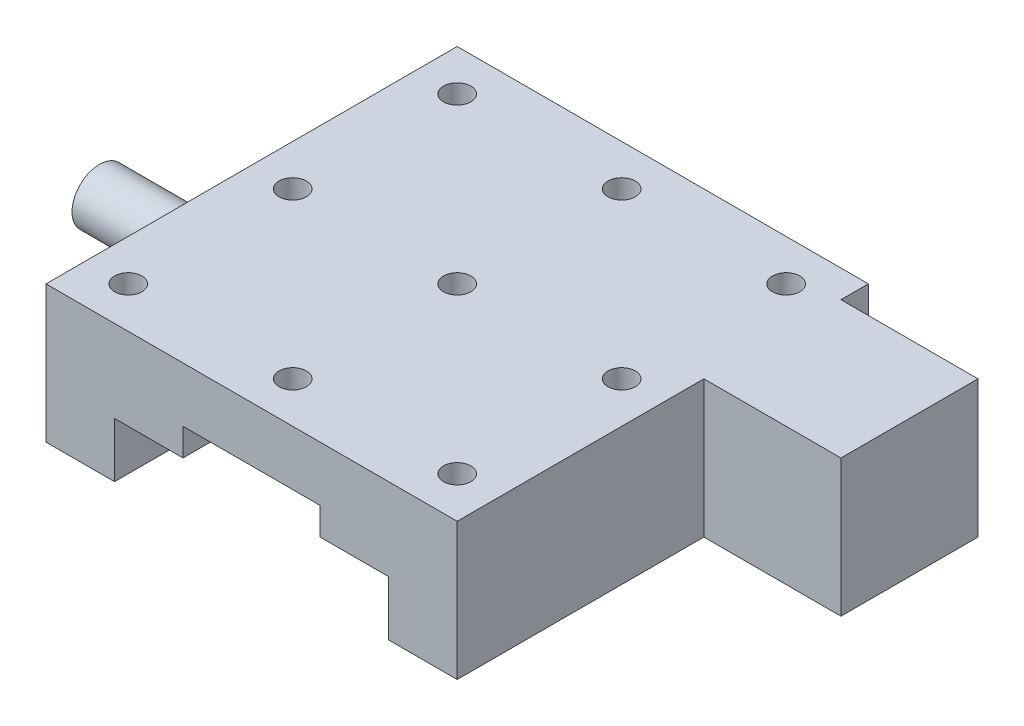
ISO-10303-21;
HEADER;
FILE_DESCRIPTION(('STEP AP214'),'2;1');
FILE_NAME('part.step','',(''),(''),'','','');
FILE_SCHEMA(('AUTOMOTIVE_DESIGN { 1 0 10303 214 1 1 1 1 }'));
ENDSEC;
DATA;
#1=APPLICATION_CONTEXT('core data for automotive mechanical design processes');
#2=APPLICATION_PROTOCOL_DEFINITION('international standard','automotive_design',2000,#1);
#3=PRODUCT_CONTEXT('',#1,'mechanical');
#4=PRODUCT('Part','Part','',(#3));
#5=PRODUCT_RELATED_PRODUCT_CATEGORY('part','',(#4));
#6=PRODUCT_DEFINITION_FORMATION('','',#4);
#7=PRODUCT_DEFINITION_CONTEXT('part definition',#1,'design');
#8=PRODUCT_DEFINITION('design','',#6,#7);
#9=PRODUCT_DEFINITION_SHAPE('','',#8);
#10=(LENGTH_UNIT() NAMED_UNIT(*) SI_UNIT(.MILLI.,.METRE.));
#11=(NAMED_UNIT(*) PLANE_ANGLE_UNIT() SI_UNIT($,.RADIAN.));
#12=(NAMED_UNIT(*) SI_UNIT($,.STERADIAN.) SOLID_ANGLE_UNIT());
#13=UNCERTAINTY_MEASURE_WITH_UNIT(LENGTH_MEASURE(1.E-05),#10,'distance_accuracy_value','');
#14=(GEOMETRIC_REPRESENTATION_CONTEXT(3) GLOBAL_UNCERTAINTY_ASSIGNED_CONTEXT((#13)) GLOBAL_UNIT_ASSIGNED_CONTEXT((#10,
#11,#12)) REPRESENTATION_CONTEXT('',''));
#15=CARTESIAN_POINT('',(0.,0.,0.));
#16=DIRECTION('',(0.,0.,1.));
#17=DIRECTION('',(1.,0.,0.));
#18=AXIS2_PLACEMENT_3D('',#15,#16,#17);
#19=CARTESIAN_POINT('',(30.,10.,0.));
#20=DIRECTION('',(-1.,0.,0.));
#21=DIRECTION('',(0.,0.,1.));
#22=AXIS2_PLACEMENT_3D('',#19,#20,#21);
#23=PLANE('',#22);
#24=DIRECTION('',(0.,1.,0.));
#25=VECTOR('',#24,1.);
#26=CARTESIAN_POINT('',(30.,10.,-28.));
#27=LINE('',#26,#25);
#28=CARTESIAN_POINT('',(30.,0.,-28.));
#29=VERTEX_POINT('',#28);
#30=CARTESIAN_POINT('',(30.,10.,-28.));
#31=VERTEX_POINT('',#30);
#32=EDGE_CURVE('E169',#29,#31,#27,.T.);
#33=ORIENTED_EDGE('',*,*,#32,.F.);
#34=DIRECTION('',(0.,0.,-1.));
#35=VECTOR('',#34,1.);
#36=CARTESIAN_POINT('',(30.,0.,0.));
#37=LINE('',#36,#35);
#38=CARTESIAN_POINT('',(30.,0.,-30.));
#39=VERTEX_POINT('',#38);
#40=EDGE_CURVE('E318',#29,#39,#37,.T.);
#41=ORIENTED_EDGE('',*,*,#40,.T.);
#42=DIRECTION('',(0.,-1.,0.));
#43=VECTOR('',#42,1.);
#44=CARTESIAN_POINT('',(30.,10.,-30.));
#45=LINE('',#44,#43);
#46=CARTESIAN_POINT('',(30.,10.,-30.));
#47=VERTEX_POINT('',#46);
#48=EDGE_CURVE('E334',#47,#39,#45,.T.);
#49=ORIENTED_EDGE('',*,*,#48,.F.);
#50=DIRECTION('',(0.,0.,-1.));
#51=VECTOR('',#50,1.);
#52=CARTESIAN_POINT('',(30.,10.,0.));
#53=LINE('',#52,#51);
#54=EDGE_CURVE('E51',#31,#47,#53,.T.);
#55=ORIENTED_EDGE('',*,*,#54,.F.);
#56=EDGE_LOOP('',(#33,#41,#49,#55));
#57=FACE_BOUND('',#56,.T.);
#58=ADVANCED_FACE('F36',(#57),#23,.F.);
#59=DIRECTION('',(0.,-1.,0.));
#60=VECTOR('',#59,1.);
#61=CARTESIAN_POINT('',(30.,10.,-18.));
#62=LINE('',#61,#60);
#63=CARTESIAN_POINT('',(30.,10.,-18.));
#64=VERTEX_POINT('',#63);
#65=CARTESIAN_POINT('',(30.,0.,-18.));
#66=VERTEX_POINT('',#65);
#67=EDGE_CURVE('E59',#64,#66,#62,.T.);
#68=ORIENTED_EDGE('',*,*,#67,.F.);
#69=CARTESIAN_POINT('',(30.,10.,0.));
#70=VERTEX_POINT('',#69);
#71=EDGE_CURVE('E173',#70,#64,#53,.T.);
#72=ORIENTED_EDGE('',*,*,#71,.F.);
#73=DIRECTION('',(0.,-1.,0.));
#74=VECTOR('',#73,1.);
#75=CARTESIAN_POINT('',(30.,10.,0.));
#76=LINE('',#75,#74);
#77=CARTESIAN_POINT('',(30.,0.,0.));
#78=VERTEX_POINT('',#77);
#79=EDGE_CURVE('E337',#70,#78,#76,.T.);
#80=ORIENTED_EDGE('',*,*,#79,.T.);
#81=EDGE_CURVE('E321',#78,#66,#37,.T.);
#82=ORIENTED_EDGE('',*,*,#81,.T.);
#83=EDGE_LOOP('',(#68,#72,#80,#82));
#84=FACE_BOUND('',#83,.T.);
#85=ADVANCED_FACE('F360',(#84),#23,.F.);
#86=CARTESIAN_POINT('',(0.,0.,0.));
#87=DIRECTION('',(0.,-1.,0.));
#88=DIRECTION('',(0.,0.,-1.));
#89=AXIS2_PLACEMENT_3D('',#86,#87,#88);
#90=PLANE('',#89);
#91=DIRECTION('',(0.,0.,1.));
#92=VECTOR('',#91,1.);
#93=CARTESIAN_POINT('',(5.,0.,-30.));
#94=LINE('',#93,#92);
#95=CARTESIAN_POINT('',(5.,0.,-30.));
#96=VERTEX_POINT('',#95);
#97=CARTESIAN_POINT('',(5.,0.,0.));
#98=VERTEX_POINT('',#97);
#99=EDGE_CURVE('E287',#96,#98,#94,.T.);
#100=ORIENTED_EDGE('',*,*,#99,.T.);
#101=DIRECTION('',(1.,0.,0.));
#102=VECTOR('',#101,1.);
#103=CARTESIAN_POINT('',(0.,0.,0.));
#104=LINE('',#103,#102);
#105=CARTESIAN_POINT('',(0.,0.,0.));
#106=VERTEX_POINT('',#105);
#107=EDGE_CURVE('E322',#106,#98,#104,.T.);
#108=ORIENTED_EDGE('',*,*,#107,.F.);
#109=DIRECTION('',(0.,0.,1.));
#110=VECTOR('',#109,1.);
#111=CARTESIAN_POINT('',(0.,0.,0.));
#112=LINE('',#111,#110);
#113=CARTESIAN_POINT('',(0.,0.,-30.));
#114=VERTEX_POINT('',#113);
#115=EDGE_CURVE('E290',#114,#106,#112,.T.);
#116=ORIENTED_EDGE('',*,*,#115,.F.);
#117=DIRECTION('',(-1.,0.,0.));
#118=VECTOR('',#117,1.);
#119=CARTESIAN_POINT('',(0.,0.,-30.));
#120=LINE('',#119,#118);
#121=EDGE_CURVE('E330',#96,#114,#120,.T.);
#122=ORIENTED_EDGE('',*,*,#121,.F.);
#123=EDGE_LOOP('',(#100,#108,#116,#122));
#124=FACE_BOUND('',#123,.T.);
#125=ADVANCED_FACE('F366',(#124),#90,.T.);
#126=CARTESIAN_POINT('',(0.,10.,0.));
#127=DIRECTION('',(1.,0.,0.));
#128=DIRECTION('',(0.,0.,-1.));
#129=AXIS2_PLACEMENT_3D('',#126,#127,#128);
#130=PLANE('',#129);
#131=CARTESIAN_POINT('',(0.,6.,-11.5));
#132=DIRECTION('',(1.,0.,0.));
#133=DIRECTION('',(0.,0.,-1.));
#134=AXIS2_PLACEMENT_3D('',#131,#132,#133);
#135=CIRCLE('',#134,1.);
#136=CARTESIAN_POINT('',(0.,6.,-12.5));
#137=VERTEX_POINT('',#136);
#138=EDGE_CURVE('E11',#137,#137,#135,.F.);
#139=ORIENTED_EDGE('',*,*,#138,.F.);
#140=EDGE_LOOP('',(#139));
#141=FACE_BOUND('',#140,.T.);
#142=ORIENTED_EDGE('',*,*,#115,.T.);
#143=DIRECTION('',(0.,-1.,0.));
#144=VECTOR('',#143,1.);
#145=CARTESIAN_POINT('',(0.,10.,0.));
#146=LINE('',#145,#144);
#147=CARTESIAN_POINT('',(0.,10.,0.));
#148=VERTEX_POINT('',#147);
#149=EDGE_CURVE('E44',#148,#106,#146,.T.);
#150=ORIENTED_EDGE('',*,*,#149,.F.);
#151=DIRECTION('',(0.,0.,1.));
#152=VECTOR('',#151,1.);
#153=CARTESIAN_POINT('',(0.,10.,0.));
#154=LINE('',#153,#152);
#155=CARTESIAN_POINT('',(0.,10.,-30.));
#156=VERTEX_POINT('',#155);
#157=EDGE_CURVE('E304',#156,#148,#154,.T.);
#158=ORIENTED_EDGE('',*,*,#157,.F.);
#159=DIRECTION('',(0.,-1.,0.));
#160=VECTOR('',#159,1.);
#161=CARTESIAN_POINT('',(0.,10.,-30.));
#162=LINE('',#161,#160);
#163=EDGE_CURVE('E331',#156,#114,#162,.T.);
#164=ORIENTED_EDGE('',*,*,#163,.T.);
#165=EDGE_LOOP('',(#142,#150,#158,#164));
#166=FACE_BOUND('',#165,.T.);
#167=ADVANCED_FACE('F38',(#141,#166),#130,.F.);
#168=CARTESIAN_POINT('',(0.,10.,0.));
#169=DIRECTION('',(0.,0.,-1.));
#170=DIRECTION('',(-1.,0.,0.));
#171=AXIS2_PLACEMENT_3D('',#168,#169,#170);
#172=PLANE('',#171);
#173=ORIENTED_EDGE('',*,*,#107,.T.);
#174=DIRECTION('',(0.,-1.,0.));
#175=VECTOR('',#174,1.);
#176=CARTESIAN_POINT('',(5.,0.,0.));
#177=LINE('',#176,#175);
#178=CARTESIAN_POINT('',(5.,4.,0.));
#179=VERTEX_POINT('',#178);
#180=EDGE_CURVE('E250',#179,#98,#177,.T.);
#181=ORIENTED_EDGE('',*,*,#180,.F.);
#182=DIRECTION('',(-1.,0.,0.));
#183=VECTOR('',#182,1.);
#184=CARTESIAN_POINT('',(5.,4.,0.));
#185=LINE('',#184,#183);
#186=CARTESIAN_POINT('',(10.,4.,0.));
#187=VERTEX_POINT('',#186);
#188=EDGE_CURVE('E283',#187,#179,#185,.T.);
#189=ORIENTED_EDGE('',*,*,#188,.F.);
#190=DIRECTION('',(0.,-1.,0.));
#191=VECTOR('',#190,1.);
#192=CARTESIAN_POINT('',(10.,4.,0.));
#193=LINE('',#192,#191);
#194=CARTESIAN_POINT('',(10.,6.,0.));
#195=VERTEX_POINT('',#194);
#196=EDGE_CURVE('E280',#195,#187,#193,.T.);
#197=ORIENTED_EDGE('',*,*,#196,.F.);
#198=DIRECTION('',(-1.,0.,0.));
#199=VECTOR('',#198,1.);
#200=CARTESIAN_POINT('',(10.,6.,0.));
#201=LINE('',#200,#199);
#202=CARTESIAN_POINT('',(20.,6.,0.));
#203=VERTEX_POINT('',#202);
#204=EDGE_CURVE('E277',#203,#195,#201,.T.);
#205=ORIENTED_EDGE('',*,*,#204,.F.);
#206=DIRECTION('',(0.,1.,0.));
#207=VECTOR('',#206,1.);
#208=CARTESIAN_POINT('',(20.,4.,0.));
#209=LINE('',#208,#207);
#210=CARTESIAN_POINT('',(20.,4.,0.));
#211=VERTEX_POINT('',#210);
#212=EDGE_CURVE('E274',#211,#203,#209,.T.);
#213=ORIENTED_EDGE('',*,*,#212,.F.);
#214=DIRECTION('',(-1.,0.,0.));
#215=VECTOR('',#214,1.);
#216=CARTESIAN_POINT('',(25.,4.,0.));
#217=LINE('',#216,#215);
#218=CARTESIAN_POINT('',(25.,4.,0.));
#219=VERTEX_POINT('',#218);
#220=EDGE_CURVE('E271',#219,#211,#217,.T.);
#221=ORIENTED_EDGE('',*,*,#220,.F.);
#222=DIRECTION('',(0.,1.,0.));
#223=VECTOR('',#222,1.);
#224=CARTESIAN_POINT('',(25.,0.,0.));
#225=LINE('',#224,#223);
#226=CARTESIAN_POINT('',(25.,0.,0.));
#227=VERTEX_POINT('',#226);
#228=EDGE_CURVE('E243',#227,#219,#225,.T.);
#229=ORIENTED_EDGE('',*,*,#228,.F.);
#230=EDGE_CURVE('E353',#227,#78,#104,.T.);
#231=ORIENTED_EDGE('',*,*,#230,.T.);
#232=ORIENTED_EDGE('',*,*,#79,.F.);
#233=DIRECTION('',(1.,0.,0.));
#234=VECTOR('',#233,1.);
#235=CARTESIAN_POINT('',(0.,10.,0.));
#236=LINE('',#235,#234);
#237=EDGE_CURVE('E306',#148,#70,#236,.T.);
#238=ORIENTED_EDGE('',*,*,#237,.F.);
#239=ORIENTED_EDGE('',*,*,#149,.T.);
#240=EDGE_LOOP('',(#173,#181,#189,#197,#205,#213,#221,#229,#231,#232,#238,#239));
#241=FACE_BOUND('',#240,.T.);
#242=ADVANCED_FACE('F344',(#241),#172,.F.);
#243=CARTESIAN_POINT('',(0.,10.,-30.));
#244=DIRECTION('',(0.,0.,1.));
#245=DIRECTION('',(1.,0.,0.));
#246=AXIS2_PLACEMENT_3D('',#243,#244,#245);
#247=PLANE('',#246);
#248=DIRECTION('',(-1.,0.,0.));
#249=VECTOR('',#248,1.);
#250=CARTESIAN_POINT('',(5.,4.,-30.));
#251=LINE('',#250,#249);
#252=CARTESIAN_POINT('',(10.,4.,-30.));
#253=VERTEX_POINT('',#252);
#254=CARTESIAN_POINT('',(5.,4.,-30.));
#255=VERTEX_POINT('',#254);
#256=EDGE_CURVE('E262',#253,#255,#251,.T.);
#257=ORIENTED_EDGE('',*,*,#256,.T.);
#258=DIRECTION('',(0.,-1.,0.));
#259=VECTOR('',#258,1.);
#260=CARTESIAN_POINT('',(5.,0.,-30.));
#261=LINE('',#260,#259);
#262=EDGE_CURVE('E265',#255,#96,#261,.T.);
#263=ORIENTED_EDGE('',*,*,#262,.T.);
#264=ORIENTED_EDGE('',*,*,#121,.T.);
#265=ORIENTED_EDGE('',*,*,#163,.F.);
#266=DIRECTION('',(-1.,0.,0.));
#267=VECTOR('',#266,1.);
#268=CARTESIAN_POINT('',(0.,10.,-30.));
#269=LINE('',#268,#267);
#270=EDGE_CURVE('E311',#47,#156,#269,.T.);
#271=ORIENTED_EDGE('',*,*,#270,.F.);
#272=ORIENTED_EDGE('',*,*,#48,.T.);
#273=CARTESIAN_POINT('',(25.,0.,-30.));
#274=VERTEX_POINT('',#273);
#275=EDGE_CURVE('E307',#39,#274,#120,.T.);
#276=ORIENTED_EDGE('',*,*,#275,.T.);
#277=DIRECTION('',(0.,1.,0.));
#278=VECTOR('',#277,1.);
#279=CARTESIAN_POINT('',(25.,0.,-30.));
#280=LINE('',#279,#278);
#281=CARTESIAN_POINT('',(25.,4.,-30.));
#282=VERTEX_POINT('',#281);
#283=EDGE_CURVE('E246',#274,#282,#280,.T.);
#284=ORIENTED_EDGE('',*,*,#283,.T.);
#285=DIRECTION('',(-1.,0.,0.));
#286=VECTOR('',#285,1.);
#287=CARTESIAN_POINT('',(25.,4.,-30.));
#288=LINE('',#287,#286);
#289=CARTESIAN_POINT('',(20.,4.,-30.));
#290=VERTEX_POINT('',#289);
#291=EDGE_CURVE('E249',#282,#290,#288,.T.);
#292=ORIENTED_EDGE('',*,*,#291,.T.);
#293=DIRECTION('',(0.,1.,0.));
#294=VECTOR('',#293,1.);
#295=CARTESIAN_POINT('',(20.,4.,-30.));
#296=LINE('',#295,#294);
#297=CARTESIAN_POINT('',(20.,6.,-30.));
#298=VERTEX_POINT('',#297);
#299=EDGE_CURVE('E253',#290,#298,#296,.T.);
#300=ORIENTED_EDGE('',*,*,#299,.T.);
#301=DIRECTION('',(-1.,0.,0.));
#302=VECTOR('',#301,1.);
#303=CARTESIAN_POINT('',(10.,6.,-30.));
#304=LINE('',#303,#302);
#305=CARTESIAN_POINT('',(10.,6.,-30.));
#306=VERTEX_POINT('',#305);
#307=EDGE_CURVE('E256',#298,#306,#304,.T.);
#308=ORIENTED_EDGE('',*,*,#307,.T.);
#309=DIRECTION('',(0.,-1.,0.));
#310=VECTOR('',#309,1.);
#311=CARTESIAN_POINT('',(10.,4.,-30.));
#312=LINE('',#311,#310);
#313=EDGE_CURVE('E259',#306,#253,#312,.T.);
#314=ORIENTED_EDGE('',*,*,#313,.T.);
#315=EDGE_LOOP('',(#257,#263,#264,#265,#271,#272,#276,#284,#292,#300,#308,#314));
#316=FACE_BOUND('',#315,.T.);
#317=ADVANCED_FACE('F363',(#316),#247,.F.);
#318=CARTESIAN_POINT('',(0.,10.,0.));
#319=DIRECTION('',(0.,-1.,0.));
#320=DIRECTION('',(0.,0.,-1.));
#321=AXIS2_PLACEMENT_3D('',#318,#319,#320);
#322=PLANE('',#321);
#323=CARTESIAN_POINT('',(15.,10.,-15.));
#324=DIRECTION('',(0.,1.,0.));
#325=DIRECTION('',(0.,0.,1.));
#326=AXIS2_PLACEMENT_3D('',#323,#324,#325);
#327=CIRCLE('',#326,0.999999999999999);
#328=CARTESIAN_POINT('',(15.,10.,-14.));
#329=VERTEX_POINT('',#328);
#330=EDGE_CURVE('E174',#329,#329,#327,.T.);
#331=ORIENTED_EDGE('',*,*,#330,.F.);
#332=EDGE_LOOP('',(#331));
#333=FACE_BOUND('',#332,.T.);
#334=CARTESIAN_POINT('',(3.,10.,-15.));
#335=DIRECTION('',(0.,1.,0.));
#336=DIRECTION('',(0.,0.,1.));
#337=AXIS2_PLACEMENT_3D('',#334,#335,#336);
#338=CIRCLE('',#337,1.);
#339=CARTESIAN_POINT('',(3.,10.,-14.));
#340=VERTEX_POINT('',#339);
#341=EDGE_CURVE('E196',#340,#340,#338,.T.);
#342=ORIENTED_EDGE('',*,*,#341,.F.);
#343=EDGE_LOOP('',(#342));
#344=FACE_BOUND('',#343,.T.);
#345=CARTESIAN_POINT('',(3.,10.,-3.));
#346=DIRECTION('',(0.,1.,0.));
#347=DIRECTION('',(0.,0.,1.));
#348=AXIS2_PLACEMENT_3D('',#345,#346,#347);
#349=CIRCLE('',#348,1.);
#350=CARTESIAN_POINT('',(3.,10.,-2.));
#351=VERTEX_POINT('',#350);
#352=EDGE_CURVE('E201',#351,#351,#349,.T.);
#353=ORIENTED_EDGE('',*,*,#352,.F.);
#354=EDGE_LOOP('',(#353));
#355=FACE_BOUND('',#354,.T.);
#356=CARTESIAN_POINT('',(15.,10.,-3.));
#357=DIRECTION('',(0.,1.,0.));
#358=DIRECTION('',(0.,0.,1.));
#359=AXIS2_PLACEMENT_3D('',#356,#357,#358);
#360=CIRCLE('',#359,1.);
#361=CARTESIAN_POINT('',(15.,10.,-2.));
#362=VERTEX_POINT('',#361);
#363=EDGE_CURVE('E207',#362,#362,#360,.T.);
#364=ORIENTED_EDGE('',*,*,#363,.F.);
#365=EDGE_LOOP('',(#364));
#366=FACE_BOUND('',#365,.T.);
#367=CARTESIAN_POINT('',(27.,10.,-3.));
#368=DIRECTION('',(0.,1.,0.));
#369=DIRECTION('',(0.,0.,1.));
#370=AXIS2_PLACEMENT_3D('',#367,#368,#369);
#371=CIRCLE('',#370,1.);
#372=CARTESIAN_POINT('',(27.,10.,-2.));
#373=VERTEX_POINT('',#372);
#374=EDGE_CURVE('E213',#373,#373,#371,.T.);
#375=ORIENTED_EDGE('',*,*,#374,.F.);
#376=EDGE_LOOP('',(#375));
#377=FACE_BOUND('',#376,.T.);
#378=CARTESIAN_POINT('',(27.,10.,-15.));
#379=DIRECTION('',(0.,1.,0.));
#380=DIRECTION('',(0.,0.,1.));
#381=AXIS2_PLACEMENT_3D('',#378,#379,#380);
#382=CIRCLE('',#381,1.);
#383=CARTESIAN_POINT('',(27.,10.,-14.));
#384=VERTEX_POINT('',#383);
#385=EDGE_CURVE('E219',#384,#384,#382,.T.);
#386=ORIENTED_EDGE('',*,*,#385,.F.);
#387=EDGE_LOOP('',(#386));
#388=FACE_BOUND('',#387,.T.);
#389=CARTESIAN_POINT('',(27.,10.,-27.));
#390=DIRECTION('',(0.,1.,0.));
#391=DIRECTION('',(0.,0.,1.));
#392=AXIS2_PLACEMENT_3D('',#389,#390,#391);
#393=CIRCLE('',#392,1.);
#394=CARTESIAN_POINT('',(27.,10.,-26.));
#395=VERTEX_POINT('',#394);
#396=EDGE_CURVE('E225',#395,#395,#393,.T.);
#397=ORIENTED_EDGE('',*,*,#396,.F.);
#398=EDGE_LOOP('',(#397));
#399=FACE_BOUND('',#398,.T.);
#400=CARTESIAN_POINT('',(15.,10.,-27.));
#401=DIRECTION('',(0.,1.,0.));
#402=DIRECTION('',(0.,0.,1.));
#403=AXIS2_PLACEMENT_3D('',#400,#401,#402);
#404=CIRCLE('',#403,1.);
#405=CARTESIAN_POINT('',(15.,10.,-26.));
#406=VERTEX_POINT('',#405);
#407=EDGE_CURVE('E231',#406,#406,#404,.T.);
#408=ORIENTED_EDGE('',*,*,#407,.F.);
#409=EDGE_LOOP('',(#408));
#410=FACE_BOUND('',#409,.T.);
#411=CARTESIAN_POINT('',(3.,10.,-27.));
#412=DIRECTION('',(0.,1.,0.));
#413=DIRECTION('',(0.,0.,1.));
#414=AXIS2_PLACEMENT_3D('',#411,#412,#413);
#415=CIRCLE('',#414,1.);
#416=CARTESIAN_POINT('',(3.,10.,-26.));
#417=VERTEX_POINT('',#416);
#418=EDGE_CURVE('E237',#417,#417,#415,.T.);
#419=ORIENTED_EDGE('',*,*,#418,.F.);
#420=EDGE_LOOP('',(#419));
#421=FACE_BOUND('',#420,.T.);
#422=ORIENTED_EDGE('',*,*,#157,.T.);
#423=ORIENTED_EDGE('',*,*,#237,.T.);
#424=ORIENTED_EDGE('',*,*,#71,.T.);
#425=DIRECTION('',(-1.,0.,0.));
#426=VECTOR('',#425,1.);
#427=CARTESIAN_POINT('',(40.,10.,-18.));
#428=LINE('',#427,#426);
#429=CARTESIAN_POINT('',(40.,10.,-18.));
#430=VERTEX_POINT('',#429);
#431=EDGE_CURVE('E154',#430,#64,#428,.T.);
#432=ORIENTED_EDGE('',*,*,#431,.F.);
#433=DIRECTION('',(0.,0.,1.));
#434=VECTOR('',#433,1.);
#435=CARTESIAN_POINT('',(40.,10.,-28.));
#436=LINE('',#435,#434);
#437=CARTESIAN_POINT('',(40.,10.,-28.));
#438=VERTEX_POINT('',#437);
#439=EDGE_CURVE('E160',#438,#430,#436,.T.);
#440=ORIENTED_EDGE('',*,*,#439,.F.);
#441=DIRECTION('',(-1.,0.,0.));
#442=VECTOR('',#441,1.);
#443=CARTESIAN_POINT('',(40.,10.,-28.));
#444=LINE('',#443,#442);
#445=EDGE_CURVE('E188',#438,#31,#444,.T.);
#446=ORIENTED_EDGE('',*,*,#445,.T.);
#447=ORIENTED_EDGE('',*,*,#54,.T.);
#448=ORIENTED_EDGE('',*,*,#270,.T.);
#449=EDGE_LOOP('',(#422,#423,#424,#432,#440,#446,#447,#448));
#450=FACE_BOUND('',#449,.T.);
#451=ADVANCED_FACE('F172',(#333,#344,#355,#366,#377,#388,#399,#410,#421,#450),#322,.F.);
#452=DIRECTION('',(0.,0.,1.));
#453=VECTOR('',#452,1.);
#454=CARTESIAN_POINT('',(25.,0.,-30.));
#455=LINE('',#454,#453);
#456=EDGE_CURVE('E268',#274,#227,#455,.T.);
#457=ORIENTED_EDGE('',*,*,#456,.F.);
#458=ORIENTED_EDGE('',*,*,#275,.F.);
#459=ORIENTED_EDGE('',*,*,#40,.F.);
#460=DIRECTION('',(-1.,0.,0.));
#461=VECTOR('',#460,1.);
#462=CARTESIAN_POINT('',(40.,0.,-28.));
#463=LINE('',#462,#461);
#464=CARTESIAN_POINT('',(40.,0.,-28.));
#465=VERTEX_POINT('',#464);
#466=EDGE_CURVE('E179',#465,#29,#463,.T.);
#467=ORIENTED_EDGE('',*,*,#466,.F.);
#468=DIRECTION('',(0.,0.,-1.));
#469=VECTOR('',#468,1.);
#470=CARTESIAN_POINT('',(40.,0.,-28.));
#471=LINE('',#470,#469);
#472=CARTESIAN_POINT('',(40.,0.,-18.));
#473=VERTEX_POINT('',#472);
#474=EDGE_CURVE('E159',#473,#465,#471,.T.);
#475=ORIENTED_EDGE('',*,*,#474,.F.);
#476=DIRECTION('',(-1.,0.,0.));
#477=VECTOR('',#476,1.);
#478=CARTESIAN_POINT('',(40.,0.,-18.));
#479=LINE('',#478,#477);
#480=EDGE_CURVE('E156',#473,#66,#479,.T.);
#481=ORIENTED_EDGE('',*,*,#480,.T.);
#482=ORIENTED_EDGE('',*,*,#81,.F.);
#483=ORIENTED_EDGE('',*,*,#230,.F.);
#484=EDGE_LOOP('',(#457,#458,#459,#467,#475,#481,#482,#483));
#485=FACE_BOUND('',#484,.T.);
#486=ADVANCED_FACE('F361',(#485),#90,.T.);
#487=CARTESIAN_POINT('',(5.,0.,-30.));
#488=DIRECTION('',(-1.,0.,0.));
#489=DIRECTION('',(0.,-1.,0.));
#490=AXIS2_PLACEMENT_3D('',#487,#488,#489);
#491=PLANE('',#490);
#492=ORIENTED_EDGE('',*,*,#180,.T.);
#493=ORIENTED_EDGE('',*,*,#99,.F.);
#494=ORIENTED_EDGE('',*,*,#262,.F.);
#495=DIRECTION('',(0.,0.,1.));
#496=VECTOR('',#495,1.);
#497=CARTESIAN_POINT('',(5.,4.,-30.));
#498=LINE('',#497,#496);
#499=EDGE_CURVE('E291',#255,#179,#498,.T.);
#500=ORIENTED_EDGE('',*,*,#499,.T.);
#501=EDGE_LOOP('',(#492,#493,#494,#500));
#502=FACE_BOUND('',#501,.T.);
#503=ADVANCED_FACE('F368',(#502),#491,.F.);
#504=CARTESIAN_POINT('',(5.,4.,-30.));
#505=DIRECTION('',(0.,1.,0.));
#506=DIRECTION('',(0.,0.,1.));
#507=AXIS2_PLACEMENT_3D('',#504,#505,#506);
#508=PLANE('',#507);
#509=ORIENTED_EDGE('',*,*,#188,.T.);
#510=ORIENTED_EDGE('',*,*,#499,.F.);
#511=ORIENTED_EDGE('',*,*,#256,.F.);
#512=DIRECTION('',(0.,0.,1.));
#513=VECTOR('',#512,1.);
#514=CARTESIAN_POINT('',(10.,4.,-30.));
#515=LINE('',#514,#513);
#516=EDGE_CURVE('E293',#253,#187,#515,.T.);
#517=ORIENTED_EDGE('',*,*,#516,.T.);
#518=EDGE_LOOP('',(#509,#510,#511,#517));
#519=FACE_BOUND('',#518,.T.);
#520=ADVANCED_FACE('F373',(#519),#508,.F.);
#521=CARTESIAN_POINT('',(10.,4.,-30.));
#522=DIRECTION('',(-1.,0.,0.));
#523=DIRECTION('',(0.,0.,1.));
#524=AXIS2_PLACEMENT_3D('',#521,#522,#523);
#525=PLANE('',#524);
#526=ORIENTED_EDGE('',*,*,#196,.T.);
#527=ORIENTED_EDGE('',*,*,#516,.F.);
#528=ORIENTED_EDGE('',*,*,#313,.F.);
#529=DIRECTION('',(0.,0.,1.));
#530=VECTOR('',#529,1.);
#531=CARTESIAN_POINT('',(10.,6.,-30.));
#532=LINE('',#531,#530);
#533=EDGE_CURVE('E295',#306,#195,#532,.T.);
#534=ORIENTED_EDGE('',*,*,#533,.T.);
#535=EDGE_LOOP('',(#526,#527,#528,#534));
#536=FACE_BOUND('',#535,.T.);
#537=ADVANCED_FACE('F377',(#536),#525,.F.);
#538=CARTESIAN_POINT('',(10.,6.,-30.));
#539=DIRECTION('',(0.,1.,0.));
#540=DIRECTION('',(0.,0.,1.));
#541=AXIS2_PLACEMENT_3D('',#538,#539,#540);
#542=PLANE('',#541);
#543=ORIENTED_EDGE('',*,*,#204,.T.);
#544=ORIENTED_EDGE('',*,*,#533,.F.);
#545=ORIENTED_EDGE('',*,*,#307,.F.);
#546=DIRECTION('',(0.,0.,1.));
#547=VECTOR('',#546,1.);
#548=CARTESIAN_POINT('',(20.,6.,-30.));
#549=LINE('',#548,#547);
#550=EDGE_CURVE('E297',#298,#203,#549,.T.);
#551=ORIENTED_EDGE('',*,*,#550,.T.);
#552=EDGE_LOOP('',(#543,#544,#545,#551));
#553=FACE_BOUND('',#552,.T.);
#554=ADVANCED_FACE('F380',(#553),#542,.F.);
#555=CARTESIAN_POINT('',(20.,4.,-30.));
#556=DIRECTION('',(1.,0.,0.));
#557=DIRECTION('',(0.,0.,-1.));
#558=AXIS2_PLACEMENT_3D('',#555,#556,#557);
#559=PLANE('',#558);
#560=ORIENTED_EDGE('',*,*,#212,.T.);
#561=ORIENTED_EDGE('',*,*,#550,.F.);
#562=ORIENTED_EDGE('',*,*,#299,.F.);
#563=DIRECTION('',(0.,0.,1.));
#564=VECTOR('',#563,1.);
#565=CARTESIAN_POINT('',(20.,4.,-30.));
#566=LINE('',#565,#564);
#567=EDGE_CURVE('E299',#290,#211,#566,.T.);
#568=ORIENTED_EDGE('',*,*,#567,.T.);
#569=EDGE_LOOP('',(#560,#561,#562,#568));
#570=FACE_BOUND('',#569,.T.);
#571=ADVANCED_FACE('F383',(#570),#559,.F.);
#572=CARTESIAN_POINT('',(25.,4.,-30.));
#573=DIRECTION('',(0.,1.,0.));
#574=DIRECTION('',(0.,0.,1.));
#575=AXIS2_PLACEMENT_3D('',#572,#573,#574);
#576=PLANE('',#575);
#577=ORIENTED_EDGE('',*,*,#220,.T.);
#578=ORIENTED_EDGE('',*,*,#567,.F.);
#579=ORIENTED_EDGE('',*,*,#291,.F.);
#580=DIRECTION('',(0.,0.,1.));
#581=VECTOR('',#580,1.);
#582=CARTESIAN_POINT('',(25.,4.,-30.));
#583=LINE('',#582,#581);
#584=EDGE_CURVE('E301',#282,#219,#583,.T.);
#585=ORIENTED_EDGE('',*,*,#584,.T.);
#586=EDGE_LOOP('',(#577,#578,#579,#585));
#587=FACE_BOUND('',#586,.T.);
#588=ADVANCED_FACE('F387',(#587),#576,.F.);
#589=CARTESIAN_POINT('',(25.,0.,-30.));
#590=DIRECTION('',(1.,0.,0.));
#591=DIRECTION('',(0.,1.,0.));
#592=AXIS2_PLACEMENT_3D('',#589,#590,#591);
#593=PLANE('',#592);
#594=ORIENTED_EDGE('',*,*,#228,.T.);
#595=ORIENTED_EDGE('',*,*,#584,.F.);
#596=ORIENTED_EDGE('',*,*,#283,.F.);
#597=ORIENTED_EDGE('',*,*,#456,.T.);
#598=EDGE_LOOP('',(#594,#595,#596,#597));
#599=FACE_BOUND('',#598,.T.);
#600=ADVANCED_FACE('F389',(#599),#593,.F.);
#601=CARTESIAN_POINT('',(3.,7.,-27.));
#602=DIRECTION('',(0.,1.,0.));
#603=DIRECTION('',(0.,0.,1.));
#604=AXIS2_PLACEMENT_3D('',#601,#602,#603);
#605=CYLINDRICAL_SURFACE('',#604,1.);
#606=CARTESIAN_POINT('',(3.,7.,-27.));
#607=DIRECTION('',(0.,1.,0.));
#608=DIRECTION('',(0.,0.,1.));
#609=AXIS2_PLACEMENT_3D('',#606,#607,#608);
#610=CIRCLE('',#609,1.);
#611=CARTESIAN_POINT('',(3.,7.,-26.));
#612=VERTEX_POINT('',#611);
#613=EDGE_CURVE('E240',#612,#612,#610,.T.);
#614=ORIENTED_EDGE('',*,*,#613,.F.);
#615=EDGE_LOOP('',(#614));
#616=FACE_BOUND('',#615,.T.);
#617=ORIENTED_EDGE('',*,*,#418,.T.);
#618=EDGE_LOOP('',(#617));
#619=FACE_BOUND('',#618,.T.);
#620=ADVANCED_FACE('F528',(#616,#619),#605,.F.);
#621=CARTESIAN_POINT('',(3.,7.,-27.));
#622=DIRECTION('',(0.,1.,0.));
#623=DIRECTION('',(0.,0.,1.));
#624=AXIS2_PLACEMENT_3D('',#621,#622,#623);
#625=PLANE('',#624);
#626=ORIENTED_EDGE('',*,*,#613,.T.);
#627=EDGE_LOOP('',(#626));
#628=FACE_BOUND('',#627,.T.);
#629=ADVANCED_FACE('F524',(#628),#625,.T.);
#630=CARTESIAN_POINT('',(15.,7.,-27.));
#631=DIRECTION('',(0.,1.,0.));
#632=DIRECTION('',(0.,0.,1.));
#633=AXIS2_PLACEMENT_3D('',#630,#631,#632);
#634=CYLINDRICAL_SURFACE('',#633,1.);
#635=CARTESIAN_POINT('',(15.,7.,-27.));
#636=DIRECTION('',(0.,1.,0.));
#637=DIRECTION('',(0.,0.,1.));
#638=AXIS2_PLACEMENT_3D('',#635,#636,#637);
#639=CIRCLE('',#638,1.);
#640=CARTESIAN_POINT('',(15.,7.,-26.));
#641=VERTEX_POINT('',#640);
#642=EDGE_CURVE('E234',#641,#641,#639,.T.);
#643=ORIENTED_EDGE('',*,*,#642,.F.);
#644=EDGE_LOOP('',(#643));
#645=FACE_BOUND('',#644,.T.);
#646=ORIENTED_EDGE('',*,*,#407,.T.);
#647=EDGE_LOOP('',(#646));
#648=FACE_BOUND('',#647,.T.);
#649=ADVANCED_FACE('F520',(#645,#648),#634,.F.);
#650=CARTESIAN_POINT('',(15.,7.,-27.));
#651=DIRECTION('',(0.,1.,0.));
#652=DIRECTION('',(0.,0.,1.));
#653=AXIS2_PLACEMENT_3D('',#650,#651,#652);
#654=PLANE('',#653);
#655=ORIENTED_EDGE('',*,*,#642,.T.);
#656=EDGE_LOOP('',(#655));
#657=FACE_BOUND('',#656,.T.);
#658=ADVANCED_FACE('F516',(#657),#654,.T.);
#659=CARTESIAN_POINT('',(27.,7.,-27.));
#660=DIRECTION('',(0.,1.,0.));
#661=DIRECTION('',(0.,0.,1.));
#662=AXIS2_PLACEMENT_3D('',#659,#660,#661);
#663=CYLINDRICAL_SURFACE('',#662,1.);
#664=CARTESIAN_POINT('',(27.,7.,-27.));
#665=DIRECTION('',(0.,1.,0.));
#666=DIRECTION('',(0.,0.,1.));
#667=AXIS2_PLACEMENT_3D('',#664,#665,#666);
#668=CIRCLE('',#667,1.);
#669=CARTESIAN_POINT('',(27.,7.,-26.));
#670=VERTEX_POINT('',#669);
#671=EDGE_CURVE('E228',#670,#670,#668,.T.);
#672=ORIENTED_EDGE('',*,*,#671,.F.);
#673=EDGE_LOOP('',(#672));
#674=FACE_BOUND('',#673,.T.);
#675=ORIENTED_EDGE('',*,*,#396,.T.);
#676=EDGE_LOOP('',(#675));
#677=FACE_BOUND('',#676,.T.);
#678=ADVANCED_FACE('F512',(#674,#677),#663,.F.);
#679=CARTESIAN_POINT('',(27.,7.,-27.));
#680=DIRECTION('',(0.,1.,0.));
#681=DIRECTION('',(0.,0.,1.));
#682=AXIS2_PLACEMENT_3D('',#679,#680,#681);
#683=PLANE('',#682);
#684=ORIENTED_EDGE('',*,*,#671,.T.);
#685=EDGE_LOOP('',(#684));
#686=FACE_BOUND('',#685,.T.);
#687=ADVANCED_FACE('F508',(#686),#683,.T.);
#688=CARTESIAN_POINT('',(27.,7.,-15.));
#689=DIRECTION('',(0.,1.,0.));
#690=DIRECTION('',(0.,0.,1.));
#691=AXIS2_PLACEMENT_3D('',#688,#689,#690);
#692=CYLINDRICAL_SURFACE('',#691,1.);
#693=CARTESIAN_POINT('',(27.,7.,-15.));
#694=DIRECTION('',(0.,1.,0.));
#695=DIRECTION('',(0.,0.,1.));
#696=AXIS2_PLACEMENT_3D('',#693,#694,#695);
#697=CIRCLE('',#696,1.);
#698=CARTESIAN_POINT('',(27.,7.,-14.));
#699=VERTEX_POINT('',#698);
#700=EDGE_CURVE('E222',#699,#699,#697,.T.);
#701=ORIENTED_EDGE('',*,*,#700,.F.);
#702=EDGE_LOOP('',(#701));
#703=FACE_BOUND('',#702,.T.);
#704=ORIENTED_EDGE('',*,*,#385,.T.);
#705=EDGE_LOOP('',(#704));
#706=FACE_BOUND('',#705,.T.);
#707=ADVANCED_FACE('F504',(#703,#706),#692,.F.);
#708=CARTESIAN_POINT('',(27.,7.,-15.));
#709=DIRECTION('',(0.,1.,0.));
#710=DIRECTION('',(0.,0.,1.));
#711=AXIS2_PLACEMENT_3D('',#708,#709,#710);
#712=PLANE('',#711);
#713=ORIENTED_EDGE('',*,*,#700,.T.);
#714=EDGE_LOOP('',(#713));
#715=FACE_BOUND('',#714,.T.);
#716=ADVANCED_FACE('F500',(#715),#712,.T.);
#717=CARTESIAN_POINT('',(27.,7.,-3.));
#718=DIRECTION('',(0.,1.,0.));
#719=DIRECTION('',(0.,0.,1.));
#720=AXIS2_PLACEMENT_3D('',#717,#718,#719);
#721=CYLINDRICAL_SURFACE('',#720,1.);
#722=CARTESIAN_POINT('',(27.,7.,-3.));
#723=DIRECTION('',(0.,1.,0.));
#724=DIRECTION('',(0.,0.,1.));
#725=AXIS2_PLACEMENT_3D('',#722,#723,#724);
#726=CIRCLE('',#725,1.);
#727=CARTESIAN_POINT('',(27.,7.,-2.));
#728=VERTEX_POINT('',#727);
#729=EDGE_CURVE('E216',#728,#728,#726,.T.);
#730=ORIENTED_EDGE('',*,*,#729,.F.);
#731=EDGE_LOOP('',(#730));
#732=FACE_BOUND('',#731,.T.);
#733=ORIENTED_EDGE('',*,*,#374,.T.);
#734=EDGE_LOOP('',(#733));
#735=FACE_BOUND('',#734,.T.);
#736=ADVANCED_FACE('F496',(#732,#735),#721,.F.);
#737=CARTESIAN_POINT('',(27.,7.,-3.));
#738=DIRECTION('',(0.,1.,0.));
#739=DIRECTION('',(0.,0.,1.));
#740=AXIS2_PLACEMENT_3D('',#737,#738,#739);
#741=PLANE('',#740);
#742=ORIENTED_EDGE('',*,*,#729,.T.);
#743=EDGE_LOOP('',(#742));
#744=FACE_BOUND('',#743,.T.);
#745=ADVANCED_FACE('F492',(#744),#741,.T.);
#746=CARTESIAN_POINT('',(15.,7.,-3.));
#747=DIRECTION('',(0.,1.,0.));
#748=DIRECTION('',(0.,0.,1.));
#749=AXIS2_PLACEMENT_3D('',#746,#747,#748);
#750=CYLINDRICAL_SURFACE('',#749,1.);
#751=CARTESIAN_POINT('',(15.,7.,-3.));
#752=DIRECTION('',(0.,1.,0.));
#753=DIRECTION('',(0.,0.,1.));
#754=AXIS2_PLACEMENT_3D('',#751,#752,#753);
#755=CIRCLE('',#754,1.);
#756=CARTESIAN_POINT('',(15.,7.,-2.));
#757=VERTEX_POINT('',#756);
#758=EDGE_CURVE('E210',#757,#757,#755,.T.);
#759=ORIENTED_EDGE('',*,*,#758,.F.);
#760=EDGE_LOOP('',(#759));
#761=FACE_BOUND('',#760,.T.);
#762=ORIENTED_EDGE('',*,*,#363,.T.);
#763=EDGE_LOOP('',(#762));
#764=FACE_BOUND('',#763,.T.);
#765=ADVANCED_FACE('F488',(#761,#764),#750,.F.);
#766=CARTESIAN_POINT('',(15.,7.,-3.));
#767=DIRECTION('',(0.,1.,0.));
#768=DIRECTION('',(0.,0.,1.));
#769=AXIS2_PLACEMENT_3D('',#766,#767,#768);
#770=PLANE('',#769);
#771=ORIENTED_EDGE('',*,*,#758,.T.);
#772=EDGE_LOOP('',(#771));
#773=FACE_BOUND('',#772,.T.);
#774=ADVANCED_FACE('F484',(#773),#770,.T.);
#775=CARTESIAN_POINT('',(3.,7.,-3.));
#776=DIRECTION('',(0.,1.,0.));
#777=DIRECTION('',(0.,0.,1.));
#778=AXIS2_PLACEMENT_3D('',#775,#776,#777);
#779=CYLINDRICAL_SURFACE('',#778,1.);
#780=CARTESIAN_POINT('',(3.,7.,-3.));
#781=DIRECTION('',(0.,1.,0.));
#782=DIRECTION('',(0.,0.,1.));
#783=AXIS2_PLACEMENT_3D('',#780,#781,#782);
#784=CIRCLE('',#783,1.);
#785=CARTESIAN_POINT('',(3.,7.,-2.));
#786=VERTEX_POINT('',#785);
#787=EDGE_CURVE('E204',#786,#786,#784,.T.);
#788=ORIENTED_EDGE('',*,*,#787,.F.);
#789=EDGE_LOOP('',(#788));
#790=FACE_BOUND('',#789,.T.);
#791=ORIENTED_EDGE('',*,*,#352,.T.);
#792=EDGE_LOOP('',(#791));
#793=FACE_BOUND('',#792,.T.);
#794=ADVANCED_FACE('F480',(#790,#793),#779,.F.);
#795=CARTESIAN_POINT('',(3.,7.,-3.));
#796=DIRECTION('',(0.,1.,0.));
#797=DIRECTION('',(0.,0.,1.));
#798=AXIS2_PLACEMENT_3D('',#795,#796,#797);
#799=PLANE('',#798);
#800=ORIENTED_EDGE('',*,*,#787,.T.);
#801=EDGE_LOOP('',(#800));
#802=FACE_BOUND('',#801,.T.);
#803=ADVANCED_FACE('F476',(#802),#799,.T.);
#804=CARTESIAN_POINT('',(3.,7.,-15.));
#805=DIRECTION('',(0.,1.,0.));
#806=DIRECTION('',(0.,0.,1.));
#807=AXIS2_PLACEMENT_3D('',#804,#805,#806);
#808=CYLINDRICAL_SURFACE('',#807,1.);
#809=CARTESIAN_POINT('',(3.,7.,-15.));
#810=DIRECTION('',(0.,1.,0.));
#811=DIRECTION('',(0.,0.,1.));
#812=AXIS2_PLACEMENT_3D('',#809,#810,#811);
#813=CIRCLE('',#812,1.);
#814=CARTESIAN_POINT('',(3.,7.,-14.));
#815=VERTEX_POINT('',#814);
#816=EDGE_CURVE('E198',#815,#815,#813,.T.);
#817=ORIENTED_EDGE('',*,*,#816,.F.);
#818=EDGE_LOOP('',(#817));
#819=FACE_BOUND('',#818,.T.);
#820=ORIENTED_EDGE('',*,*,#341,.T.);
#821=EDGE_LOOP('',(#820));
#822=FACE_BOUND('',#821,.T.);
#823=ADVANCED_FACE('F472',(#819,#822),#808,.F.);
#824=CARTESIAN_POINT('',(3.,7.,-15.));
#825=DIRECTION('',(0.,1.,0.));
#826=DIRECTION('',(0.,0.,1.));
#827=AXIS2_PLACEMENT_3D('',#824,#825,#826);
#828=PLANE('',#827);
#829=ORIENTED_EDGE('',*,*,#816,.T.);
#830=EDGE_LOOP('',(#829));
#831=FACE_BOUND('',#830,.T.);
#832=ADVANCED_FACE('F468',(#831),#828,.T.);
#833=CARTESIAN_POINT('',(15.,7.,-15.));
#834=DIRECTION('',(0.,1.,0.));
#835=DIRECTION('',(0.,0.,1.));
#836=AXIS2_PLACEMENT_3D('',#833,#834,#835);
#837=CYLINDRICAL_SURFACE('',#836,0.999999999999999);
#838=CARTESIAN_POINT('',(15.,7.,-15.));
#839=DIRECTION('',(0.,1.,0.));
#840=DIRECTION('',(0.,0.,1.));
#841=AXIS2_PLACEMENT_3D('',#838,#839,#840);
#842=CIRCLE('',#841,0.999999999999999);
#843=CARTESIAN_POINT('',(15.,7.,-14.));
#844=VERTEX_POINT('',#843);
#845=EDGE_CURVE('E177',#844,#844,#842,.T.);
#846=ORIENTED_EDGE('',*,*,#845,.F.);
#847=EDGE_LOOP('',(#846));
#848=FACE_BOUND('',#847,.T.);
#849=ORIENTED_EDGE('',*,*,#330,.T.);
#850=EDGE_LOOP('',(#849));
#851=FACE_BOUND('',#850,.T.);
#852=ADVANCED_FACE('F464',(#848,#851),#837,.F.);
#853=CARTESIAN_POINT('',(15.,7.,-15.));
#854=DIRECTION('',(0.,1.,0.));
#855=DIRECTION('',(0.,0.,1.));
#856=AXIS2_PLACEMENT_3D('',#853,#854,#855);
#857=PLANE('',#856);
#858=ORIENTED_EDGE('',*,*,#845,.T.);
#859=EDGE_LOOP('',(#858));
#860=FACE_BOUND('',#859,.T.);
#861=ADVANCED_FACE('F461',(#860),#857,.T.);
#862=CARTESIAN_POINT('',(40.,10.,-18.));
#863=DIRECTION('',(0.,0.,-1.));
#864=DIRECTION('',(0.,1.,0.));
#865=AXIS2_PLACEMENT_3D('',#862,#863,#864);
#866=PLANE('',#865);
#867=ORIENTED_EDGE('',*,*,#67,.T.);
#868=ORIENTED_EDGE('',*,*,#480,.F.);
#869=DIRECTION('',(0.,-1.,0.));
#870=VECTOR('',#869,1.);
#871=CARTESIAN_POINT('',(40.,10.,-18.));
#872=LINE('',#871,#870);
#873=EDGE_CURVE('E150',#430,#473,#872,.T.);
#874=ORIENTED_EDGE('',*,*,#873,.F.);
#875=ORIENTED_EDGE('',*,*,#431,.T.);
#876=EDGE_LOOP('',(#867,#868,#874,#875));
#877=FACE_BOUND('',#876,.T.);
#878=ADVANCED_FACE('F152',(#877),#866,.F.);
#879=CARTESIAN_POINT('',(40.,10.,-28.));
#880=DIRECTION('',(0.,0.,1.));
#881=DIRECTION('',(1.,0.,0.));
#882=AXIS2_PLACEMENT_3D('',#879,#880,#881);
#883=PLANE('',#882);
#884=ORIENTED_EDGE('',*,*,#32,.T.);
#885=ORIENTED_EDGE('',*,*,#445,.F.);
#886=DIRECTION('',(0.,1.,0.));
#887=VECTOR('',#886,1.);
#888=CARTESIAN_POINT('',(40.,10.,-28.));
#889=LINE('',#888,#887);
#890=EDGE_CURVE('E165',#465,#438,#889,.T.);
#891=ORIENTED_EDGE('',*,*,#890,.F.);
#892=ORIENTED_EDGE('',*,*,#466,.T.);
#893=EDGE_LOOP('',(#884,#885,#891,#892));
#894=FACE_BOUND('',#893,.T.);
#895=ADVANCED_FACE('F395',(#894),#883,.F.);
#896=CARTESIAN_POINT('',(40.,0.,0.));
#897=DIRECTION('',(1.,0.,0.));
#898=DIRECTION('',(0.,0.,-1.));
#899=AXIS2_PLACEMENT_3D('',#896,#897,#898);
#900=PLANE('',#899);
#901=ORIENTED_EDGE('',*,*,#439,.T.);
#902=ORIENTED_EDGE('',*,*,#873,.T.);
#903=ORIENTED_EDGE('',*,*,#474,.T.);
#904=ORIENTED_EDGE('',*,*,#890,.T.);
#905=EDGE_LOOP('',(#901,#902,#903,#904));
#906=FACE_BOUND('',#905,.T.);
#907=ADVANCED_FACE('F163',(#906),#900,.T.);
#908=CARTESIAN_POINT('',(-1.6,6.,-11.5));
#909=DIRECTION('',(1.,0.,0.));
#910=DIRECTION('',(0.,0.,-1.));
#911=AXIS2_PLACEMENT_3D('',#908,#909,#910);
#912=CYLINDRICAL_SURFACE('',#911,1.);
#913=CARTESIAN_POINT('',(-1.6,6.,-11.5));
#914=DIRECTION('',(-1.,0.,0.));
#915=DIRECTION('',(0.,0.,1.));
#916=AXIS2_PLACEMENT_3D('',#913,#914,#915);
#917=CIRCLE('',#916,1.);
#918=CARTESIAN_POINT('',(-1.6,6.,-10.5));
#919=VERTEX_POINT('',#918);
#920=EDGE_CURVE('E401',#919,#919,#917,.T.);
#921=ORIENTED_EDGE('',*,*,#920,.F.);
#922=EDGE_LOOP('',(#921));
#923=FACE_BOUND('',#922,.T.);
#924=ORIENTED_EDGE('',*,*,#138,.T.);
#925=EDGE_LOOP('',(#924));
#926=FACE_BOUND('',#925,.T.);
#927=ADVANCED_FACE('F416',(#923,#926),#912,.T.);
#928=CARTESIAN_POINT('',(-7.6,6.,-11.5));
#929=DIRECTION('',(1.,0.,0.));
#930=DIRECTION('',(0.,0.,-1.));
#931=AXIS2_PLACEMENT_3D('',#928,#929,#930);
#932=CYLINDRICAL_SURFACE('',#931,2.);
#933=CARTESIAN_POINT('',(-7.6,6.,-11.5));
#934=DIRECTION('',(-1.,0.,0.));
#935=DIRECTION('',(0.,0.,1.));
#936=AXIS2_PLACEMENT_3D('',#933,#934,#935);
#937=CIRCLE('',#936,2.);
#938=CARTESIAN_POINT('',(-7.6,6.,-9.5));
#939=VERTEX_POINT('',#938);
#940=EDGE_CURVE('E404',#939,#939,#937,.T.);
#941=ORIENTED_EDGE('',*,*,#940,.F.);
#942=EDGE_LOOP('',(#941));
#943=FACE_BOUND('',#942,.T.);
#944=CARTESIAN_POINT('',(-1.6,6.,-11.5));
#945=DIRECTION('',(-1.,0.,0.));
#946=DIRECTION('',(0.,0.,1.));
#947=AXIS2_PLACEMENT_3D('',#944,#945,#946);
#948=CIRCLE('',#947,2.);
#949=CARTESIAN_POINT('',(-1.6,6.,-9.5));
#950=VERTEX_POINT('',#949);
#951=EDGE_CURVE('E405',#950,#950,#948,.T.);
#952=ORIENTED_EDGE('',*,*,#951,.T.);
#953=EDGE_LOOP('',(#952));
#954=FACE_BOUND('',#953,.T.);
#955=ADVANCED_FACE('F413',(#943,#954),#932,.T.);
#956=CARTESIAN_POINT('',(-7.6,6.,-11.5));
#957=DIRECTION('',(-1.,0.,0.));
#958=DIRECTION('',(0.,0.,1.));
#959=AXIS2_PLACEMENT_3D('',#956,#957,#958);
#960=PLANE('',#959);
#961=ORIENTED_EDGE('',*,*,#940,.T.);
#962=EDGE_LOOP('',(#961));
#963=FACE_BOUND('',#962,.T.);
#964=ADVANCED_FACE('F411',(#963),#960,.T.);
#965=CARTESIAN_POINT('',(-1.6,6.,-11.5));
#966=DIRECTION('',(-1.,0.,0.));
#967=DIRECTION('',(0.,0.,1.));
#968=AXIS2_PLACEMENT_3D('',#965,#966,#967);
#969=PLANE('',#968);
#970=ORIENTED_EDGE('',*,*,#920,.T.);
#971=EDGE_LOOP('',(#970));
#972=FACE_BOUND('',#971,.T.);
#973=ORIENTED_EDGE('',*,*,#951,.F.);
#974=EDGE_LOOP('',(#973));
#975=FACE_BOUND('',#974,.T.);
#976=ADVANCED_FACE('F420',(#972,#975),#969,.F.);
#977=CLOSED_SHELL('',(#58,#85,#125,#167,#242,#317,#451,#486,#503,#520,#537,#554,#571,#588,#600,
#620,#629,#649,#658,#678,#687,#707,#716,#736,#745,#765,#774,#794,#803,#823,#832,#852,#861,#878,
#895,#907,#927,#955,#964,#976));
#978=MANIFOLD_SOLID_BREP('B2',#977);
#979=ADVANCED_BREP_SHAPE_REPRESENTATION('',(#18,#978),#14);
#980=SHAPE_DEFINITION_REPRESENTATION(#9,#979);
ENDSEC;
END-ISO-10303-21;
